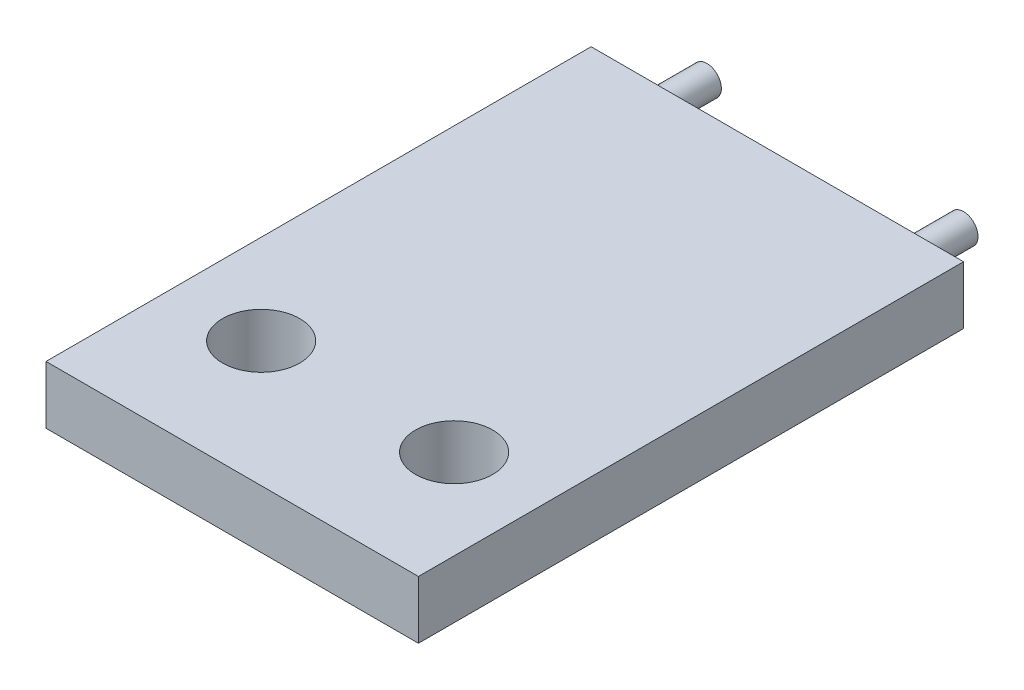
ISO-10303-21;
HEADER;
FILE_DESCRIPTION(('STEP AP214'),'2;1');
FILE_NAME('part.step','',(''),(''),'','','');
FILE_SCHEMA(('AUTOMOTIVE_DESIGN { 1 0 10303 214 1 1 1 1 }'));
ENDSEC;
DATA;
#1=APPLICATION_CONTEXT('core data for automotive mechanical design processes');
#2=APPLICATION_PROTOCOL_DEFINITION('international standard','automotive_design',2000,#1);
#3=PRODUCT_CONTEXT('',#1,'mechanical');
#4=PRODUCT('Part','Part','',(#3));
#5=PRODUCT_RELATED_PRODUCT_CATEGORY('part','',(#4));
#6=PRODUCT_DEFINITION_FORMATION('','',#4);
#7=PRODUCT_DEFINITION_CONTEXT('part definition',#1,'design');
#8=PRODUCT_DEFINITION('design','',#6,#7);
#9=PRODUCT_DEFINITION_SHAPE('','',#8);
#10=(LENGTH_UNIT() NAMED_UNIT(*) SI_UNIT(.MILLI.,.METRE.));
#11=(NAMED_UNIT(*) PLANE_ANGLE_UNIT() SI_UNIT($,.RADIAN.));
#12=(NAMED_UNIT(*) SI_UNIT($,.STERADIAN.) SOLID_ANGLE_UNIT());
#13=UNCERTAINTY_MEASURE_WITH_UNIT(LENGTH_MEASURE(1.E-05),#10,'distance_accuracy_value','');
#14=(GEOMETRIC_REPRESENTATION_CONTEXT(3) GLOBAL_UNCERTAINTY_ASSIGNED_CONTEXT((#13)) GLOBAL_UNIT_ASSIGNED_CONTEXT((#10,
#11,#12)) REPRESENTATION_CONTEXT('',''));
#15=CARTESIAN_POINT('',(0.,0.,0.));
#16=DIRECTION('',(0.,0.,1.));
#17=DIRECTION('',(1.,0.,0.));
#18=AXIS2_PLACEMENT_3D('',#15,#16,#17);
#19=CARTESIAN_POINT('',(0.,7.62,0.));
#20=DIRECTION('',(0.,1.,0.));
#21=DIRECTION('',(0.,0.,1.));
#22=AXIS2_PLACEMENT_3D('',#19,#20,#21);
#23=PLANE('',#22);
#24=DIRECTION('',(1.,0.,0.));
#25=VECTOR('',#24,1.);
#26=CARTESIAN_POINT('',(-24.511,7.62,-20.955));
#27=LINE('',#26,#25);
#28=CARTESIAN_POINT('',(-24.511,7.62,-20.955));
#29=VERTEX_POINT('',#28);
#30=CARTESIAN_POINT('',(24.511,7.62,-20.955));
#31=VERTEX_POINT('',#30);
#32=EDGE_CURVE('E47',#29,#31,#27,.T.);
#33=ORIENTED_EDGE('',*,*,#32,.F.);
#34=DIRECTION('',(0.,0.,1.));
#35=VECTOR('',#34,1.);
#36=CARTESIAN_POINT('',(-24.511,7.62,50.8));
#37=LINE('',#36,#35);
#38=CARTESIAN_POINT('',(-24.511,7.62,50.8));
#39=VERTEX_POINT('',#38);
#40=EDGE_CURVE('E88',#29,#39,#37,.T.);
#41=ORIENTED_EDGE('',*,*,#40,.T.);
#42=DIRECTION('',(1.,0.,0.));
#43=VECTOR('',#42,1.);
#44=CARTESIAN_POINT('',(24.511,7.62,50.8));
#45=LINE('',#44,#43);
#46=CARTESIAN_POINT('',(24.511,7.62,50.8));
#47=VERTEX_POINT('',#46);
#48=EDGE_CURVE('E56',#39,#47,#45,.T.);
#49=ORIENTED_EDGE('',*,*,#48,.T.);
#50=DIRECTION('',(0.,0.,-1.));
#51=VECTOR('',#50,1.);
#52=CARTESIAN_POINT('',(24.511,7.62,50.8));
#53=LINE('',#52,#51);
#54=EDGE_CURVE('E82',#47,#31,#53,.T.);
#55=ORIENTED_EDGE('',*,*,#54,.T.);
#56=EDGE_LOOP('',(#33,#41,#49,#55));
#57=FACE_BOUND('',#56,.T.);
#58=CARTESIAN_POINT('',(-12.7,7.62,34.29));
#59=DIRECTION('',(0.,1.,0.));
#60=DIRECTION('',(0.,0.,1.));
#61=AXIS2_PLACEMENT_3D('',#58,#59,#60);
#62=CIRCLE('',#61,5.08);
#63=CARTESIAN_POINT('',(-12.7,7.62,39.37));
#64=VERTEX_POINT('',#63);
#65=EDGE_CURVE('E99',#64,#64,#62,.T.);
#66=ORIENTED_EDGE('',*,*,#65,.F.);
#67=EDGE_LOOP('',(#66));
#68=FACE_BOUND('',#67,.T.);
#69=CARTESIAN_POINT('',(12.7,7.62,34.29));
#70=DIRECTION('',(0.,1.,0.));
#71=DIRECTION('',(0.,0.,1.));
#72=AXIS2_PLACEMENT_3D('',#69,#70,#71);
#73=CIRCLE('',#72,5.08);
#74=CARTESIAN_POINT('',(12.7,7.62,39.37));
#75=VERTEX_POINT('',#74);
#76=EDGE_CURVE('E103',#75,#75,#73,.F.);
#77=ORIENTED_EDGE('',*,*,#76,.T.);
#78=EDGE_LOOP('',(#77));
#79=FACE_BOUND('',#78,.T.);
#80=ADVANCED_FACE('F32',(#57,#68,#79),#23,.T.);
#81=CARTESIAN_POINT('',(0.,0.,0.));
#82=DIRECTION('',(0.,1.,0.));
#83=DIRECTION('',(0.,0.,1.));
#84=AXIS2_PLACEMENT_3D('',#81,#82,#83);
#85=PLANE('',#84);
#86=CARTESIAN_POINT('',(-12.7,0.,34.29));
#87=DIRECTION('',(0.,1.,0.));
#88=DIRECTION('',(0.,0.,1.));
#89=AXIS2_PLACEMENT_3D('',#86,#87,#88);
#90=CIRCLE('',#89,5.08);
#91=CARTESIAN_POINT('',(-12.7,0.,39.37));
#92=VERTEX_POINT('',#91);
#93=EDGE_CURVE('E96',#92,#92,#90,.T.);
#94=ORIENTED_EDGE('',*,*,#93,.T.);
#95=EDGE_LOOP('',(#94));
#96=FACE_BOUND('',#95,.T.);
#97=DIRECTION('',(0.,0.,1.));
#98=VECTOR('',#97,1.);
#99=CARTESIAN_POINT('',(-24.511,0.,50.8));
#100=LINE('',#99,#98);
#101=CARTESIAN_POINT('',(-24.511,0.,-20.955));
#102=VERTEX_POINT('',#101);
#103=CARTESIAN_POINT('',(-24.511,0.,50.8));
#104=VERTEX_POINT('',#103);
#105=EDGE_CURVE('E77',#102,#104,#100,.T.);
#106=ORIENTED_EDGE('',*,*,#105,.F.);
#107=DIRECTION('',(1.,0.,0.));
#108=VECTOR('',#107,1.);
#109=CARTESIAN_POINT('',(-24.511,0.,-20.955));
#110=LINE('',#109,#108);
#111=CARTESIAN_POINT('',(24.511,0.,-20.955));
#112=VERTEX_POINT('',#111);
#113=EDGE_CURVE('E87',#102,#112,#110,.T.);
#114=ORIENTED_EDGE('',*,*,#113,.T.);
#115=DIRECTION('',(0.,0.,-1.));
#116=VECTOR('',#115,1.);
#117=CARTESIAN_POINT('',(24.511,0.,50.8));
#118=LINE('',#117,#116);
#119=CARTESIAN_POINT('',(24.511,0.,50.8));
#120=VERTEX_POINT('',#119);
#121=EDGE_CURVE('E76',#120,#112,#118,.T.);
#122=ORIENTED_EDGE('',*,*,#121,.F.);
#123=DIRECTION('',(1.,0.,0.));
#124=VECTOR('',#123,1.);
#125=CARTESIAN_POINT('',(24.511,0.,50.8));
#126=LINE('',#125,#124);
#127=EDGE_CURVE('E68',#104,#120,#126,.T.);
#128=ORIENTED_EDGE('',*,*,#127,.F.);
#129=EDGE_LOOP('',(#106,#114,#122,#128));
#130=FACE_BOUND('',#129,.T.);
#131=CARTESIAN_POINT('',(12.7,0.,34.29));
#132=DIRECTION('',(0.,1.,0.));
#133=DIRECTION('',(0.,0.,1.));
#134=AXIS2_PLACEMENT_3D('',#131,#132,#133);
#135=CIRCLE('',#134,5.08);
#136=CARTESIAN_POINT('',(12.7,0.,39.37));
#137=VERTEX_POINT('',#136);
#138=EDGE_CURVE('E93',#137,#137,#135,.F.);
#139=ORIENTED_EDGE('',*,*,#138,.F.);
#140=EDGE_LOOP('',(#139));
#141=FACE_BOUND('',#140,.T.);
#142=ADVANCED_FACE('F84',(#96,#130,#141),#85,.F.);
#143=CARTESIAN_POINT('',(-24.511,7.62,50.8));
#144=DIRECTION('',(1.,0.,0.));
#145=DIRECTION('',(0.,0.,-1.));
#146=AXIS2_PLACEMENT_3D('',#143,#144,#145);
#147=PLANE('',#146);
#148=ORIENTED_EDGE('',*,*,#40,.F.);
#149=DIRECTION('',(0.,1.,0.));
#150=VECTOR('',#149,1.);
#151=CARTESIAN_POINT('',(-24.511,0.,-20.955));
#152=LINE('',#151,#150);
#153=EDGE_CURVE('E108',#102,#29,#152,.T.);
#154=ORIENTED_EDGE('',*,*,#153,.F.);
#155=ORIENTED_EDGE('',*,*,#105,.T.);
#156=DIRECTION('',(0.,-1.,0.));
#157=VECTOR('',#156,1.);
#158=CARTESIAN_POINT('',(-24.511,7.62,50.8));
#159=LINE('',#158,#157);
#160=EDGE_CURVE('E11',#39,#104,#159,.T.);
#161=ORIENTED_EDGE('',*,*,#160,.F.);
#162=EDGE_LOOP('',(#148,#154,#155,#161));
#163=FACE_BOUND('',#162,.T.);
#164=ADVANCED_FACE('F34',(#163),#147,.F.);
#165=CARTESIAN_POINT('',(24.511,7.62,50.8));
#166=DIRECTION('',(0.,0.,-1.));
#167=DIRECTION('',(-1.,0.,0.));
#168=AXIS2_PLACEMENT_3D('',#165,#166,#167);
#169=PLANE('',#168);
#170=ORIENTED_EDGE('',*,*,#127,.T.);
#171=DIRECTION('',(0.,-1.,0.));
#172=VECTOR('',#171,1.);
#173=CARTESIAN_POINT('',(24.511,7.62,50.8));
#174=LINE('',#173,#172);
#175=EDGE_CURVE('E40',#47,#120,#174,.T.);
#176=ORIENTED_EDGE('',*,*,#175,.F.);
#177=ORIENTED_EDGE('',*,*,#48,.F.);
#178=ORIENTED_EDGE('',*,*,#160,.T.);
#179=EDGE_LOOP('',(#170,#176,#177,#178));
#180=FACE_BOUND('',#179,.T.);
#181=ADVANCED_FACE('F70',(#180),#169,.F.);
#182=CARTESIAN_POINT('',(24.511,7.62,50.8));
#183=DIRECTION('',(-1.,0.,0.));
#184=DIRECTION('',(0.,0.,1.));
#185=AXIS2_PLACEMENT_3D('',#182,#183,#184);
#186=PLANE('',#185);
#187=ORIENTED_EDGE('',*,*,#121,.T.);
#188=DIRECTION('',(0.,1.,0.));
#189=VECTOR('',#188,1.);
#190=CARTESIAN_POINT('',(24.511,0.,-20.955));
#191=LINE('',#190,#189);
#192=EDGE_CURVE('E100',#112,#31,#191,.T.);
#193=ORIENTED_EDGE('',*,*,#192,.T.);
#194=ORIENTED_EDGE('',*,*,#54,.F.);
#195=ORIENTED_EDGE('',*,*,#175,.T.);
#196=EDGE_LOOP('',(#187,#193,#194,#195));
#197=FACE_BOUND('',#196,.T.);
#198=ADVANCED_FACE('F81',(#197),#186,.F.);
#199=CARTESIAN_POINT('',(-12.7,0.,34.29));
#200=DIRECTION('',(0.,1.,0.));
#201=DIRECTION('',(0.,0.,1.));
#202=AXIS2_PLACEMENT_3D('',#199,#200,#201);
#203=CYLINDRICAL_SURFACE('',#202,5.08);
#204=CARTESIAN_POINT('',(-12.7,0.,39.37));
#205=CARTESIAN_POINT('',(-12.7,0.0793749999999998,39.37));
#206=CARTESIAN_POINT('',(-12.7,0.15875,39.37));
#207=CARTESIAN_POINT('',(-12.7,0.3175,39.37));
#208=CARTESIAN_POINT('',(-12.7,0.396875,39.37));
#209=CARTESIAN_POINT('',(-12.7,0.555625,39.37));
#210=CARTESIAN_POINT('',(-12.7,0.635,39.37));
#211=CARTESIAN_POINT('',(-12.7,0.79375,39.37));
#212=CARTESIAN_POINT('',(-12.7,0.873125,39.37));
#213=CARTESIAN_POINT('',(-12.7,1.031875,39.37));
#214=CARTESIAN_POINT('',(-12.7,1.11125,39.37));
#215=CARTESIAN_POINT('',(-12.7,1.27,39.37));
#216=CARTESIAN_POINT('',(-12.7,1.349375,39.37));
#217=CARTESIAN_POINT('',(-12.7,1.508125,39.37));
#218=CARTESIAN_POINT('',(-12.7,1.5875,39.37));
#219=CARTESIAN_POINT('',(-12.7,1.74625,39.37));
#220=CARTESIAN_POINT('',(-12.7,1.825625,39.37));
#221=CARTESIAN_POINT('',(-12.7,1.984375,39.37));
#222=CARTESIAN_POINT('',(-12.7,2.06375,39.37));
#223=CARTESIAN_POINT('',(-12.7,2.2225,39.37));
#224=CARTESIAN_POINT('',(-12.7,2.301875,39.37));
#225=CARTESIAN_POINT('',(-12.7,2.460625,39.37));
#226=CARTESIAN_POINT('',(-12.7,2.54,39.37));
#227=CARTESIAN_POINT('',(-12.7,2.69875,39.37));
#228=CARTESIAN_POINT('',(-12.7,2.778125,39.37));
#229=CARTESIAN_POINT('',(-12.7,2.936875,39.37));
#230=CARTESIAN_POINT('',(-12.7,3.01625,39.37));
#231=CARTESIAN_POINT('',(-12.7,3.175,39.37));
#232=CARTESIAN_POINT('',(-12.7,3.254375,39.37));
#233=CARTESIAN_POINT('',(-12.7,3.413125,39.37));
#234=CARTESIAN_POINT('',(-12.7,3.4925,39.37));
#235=CARTESIAN_POINT('',(-12.7,3.65125,39.37));
#236=CARTESIAN_POINT('',(-12.7,3.730625,39.37));
#237=CARTESIAN_POINT('',(-12.7,3.889375,39.37));
#238=CARTESIAN_POINT('',(-12.7,3.96875,39.37));
#239=CARTESIAN_POINT('',(-12.7,4.1275,39.37));
#240=CARTESIAN_POINT('',(-12.7,4.206875,39.37));
#241=CARTESIAN_POINT('',(-12.7,4.365625,39.37));
#242=CARTESIAN_POINT('',(-12.7,4.445,39.37));
#243=CARTESIAN_POINT('',(-12.7,4.60375,39.37));
#244=CARTESIAN_POINT('',(-12.7,4.683125,39.37));
#245=CARTESIAN_POINT('',(-12.7,4.841875,39.37));
#246=CARTESIAN_POINT('',(-12.7,4.92125,39.37));
#247=CARTESIAN_POINT('',(-12.7,5.08,39.37));
#248=CARTESIAN_POINT('',(-12.7,5.159375,39.37));
#249=CARTESIAN_POINT('',(-12.7,5.318125,39.37));
#250=CARTESIAN_POINT('',(-12.7,5.3975,39.37));
#251=CARTESIAN_POINT('',(-12.7,5.55625,39.37));
#252=CARTESIAN_POINT('',(-12.7,5.635625,39.37));
#253=CARTESIAN_POINT('',(-12.7,5.794375,39.37));
#254=CARTESIAN_POINT('',(-12.7,5.87375,39.37));
#255=CARTESIAN_POINT('',(-12.7,6.0325,39.37));
#256=CARTESIAN_POINT('',(-12.7,6.111875,39.37));
#257=CARTESIAN_POINT('',(-12.7,6.270625,39.37));
#258=CARTESIAN_POINT('',(-12.7,6.35,39.37));
#259=CARTESIAN_POINT('',(-12.7,6.50875,39.37));
#260=CARTESIAN_POINT('',(-12.7,6.588125,39.37));
#261=CARTESIAN_POINT('',(-12.7,6.746875,39.37));
#262=CARTESIAN_POINT('',(-12.7,6.82625,39.37));
#263=CARTESIAN_POINT('',(-12.7,6.985,39.37));
#264=CARTESIAN_POINT('',(-12.7,7.064375,39.37));
#265=CARTESIAN_POINT('',(-12.7,7.223125,39.37));
#266=CARTESIAN_POINT('',(-12.7,7.3025,39.37));
#267=CARTESIAN_POINT('',(-12.7,7.46125,39.37));
#268=CARTESIAN_POINT('',(-12.7,7.540625,39.37));
#269=CARTESIAN_POINT('',(-12.7,7.62,39.37));
#270=B_SPLINE_CURVE_WITH_KNOTS('',3,(#204,#205,#206,#207,#208,#209,#210,#211,#212,#213,#214,
#215,#216,#217,#218,#219,#220,#221,#222,#223,#224,#225,#226,#227,#228,#229,#230,#231,#232,#233,
#234,#235,#236,#237,#238,#239,#240,#241,#242,#243,#244,#245,#246,#247,#248,#249,#250,#251,#252,
#253,#254,#255,#256,#257,#258,#259,#260,#261,#262,#263,#264,#265,#266,#267,#268,#269),
.UNSPECIFIED.,.F.,.F.,(4,2,2,2,2,2,2,2,2,2,2,2,2,2,2,2,2,2,2,2,2,2,2,2,2,2,2,2,2,2,2,2,4),(0.,
0.238125,0.47625,0.714375,0.9525,1.190625,1.42875,1.666875,1.905,2.143125,2.38125,2.619375,
2.8575,3.095625,3.33375,3.571875,3.81,4.048125,4.28625,4.524375,4.7625,5.000625,5.23875,
5.476875,5.715,5.953125,6.19125,6.429375,6.6675,6.905625,7.14375,7.381875,7.62),.UNSPECIFIED.);
#271=EDGE_CURVE('BSEAM160',#92,#64,#270,.T.);
#272=ORIENTED_EDGE('',*,*,#93,.F.);
#273=ORIENTED_EDGE('',*,*,#65,.T.);
#274=ORIENTED_EDGE('',*,*,#271,.T.);
#275=ORIENTED_EDGE('',*,*,#271,.F.);
#276=EDGE_LOOP('',(#272,#274,#273,#275));
#277=FACE_BOUND('',#276,.T.);
#278=ADVANCED_FACE('F160',(#277),#203,.F.);
#279=CARTESIAN_POINT('',(12.7,0.,34.29));
#280=DIRECTION('',(0.,1.,0.));
#281=DIRECTION('',(0.,0.,1.));
#282=AXIS2_PLACEMENT_3D('',#279,#280,#281);
#283=CYLINDRICAL_SURFACE('',#282,5.08);
#284=CARTESIAN_POINT('',(12.7,0.,39.37));
#285=CARTESIAN_POINT('',(12.7,0.0793749999999998,39.37));
#286=CARTESIAN_POINT('',(12.7,0.15875,39.37));
#287=CARTESIAN_POINT('',(12.7,0.3175,39.37));
#288=CARTESIAN_POINT('',(12.7,0.396875,39.37));
#289=CARTESIAN_POINT('',(12.7,0.555625,39.37));
#290=CARTESIAN_POINT('',(12.7,0.635,39.37));
#291=CARTESIAN_POINT('',(12.7,0.79375,39.37));
#292=CARTESIAN_POINT('',(12.7,0.873125,39.37));
#293=CARTESIAN_POINT('',(12.7,1.031875,39.37));
#294=CARTESIAN_POINT('',(12.7,1.11125,39.37));
#295=CARTESIAN_POINT('',(12.7,1.27,39.37));
#296=CARTESIAN_POINT('',(12.7,1.349375,39.37));
#297=CARTESIAN_POINT('',(12.7,1.508125,39.37));
#298=CARTESIAN_POINT('',(12.7,1.5875,39.37));
#299=CARTESIAN_POINT('',(12.7,1.74625,39.37));
#300=CARTESIAN_POINT('',(12.7,1.825625,39.37));
#301=CARTESIAN_POINT('',(12.7,1.984375,39.37));
#302=CARTESIAN_POINT('',(12.7,2.06375,39.37));
#303=CARTESIAN_POINT('',(12.7,2.2225,39.37));
#304=CARTESIAN_POINT('',(12.7,2.301875,39.37));
#305=CARTESIAN_POINT('',(12.7,2.460625,39.37));
#306=CARTESIAN_POINT('',(12.7,2.54,39.37));
#307=CARTESIAN_POINT('',(12.7,2.69875,39.37));
#308=CARTESIAN_POINT('',(12.7,2.778125,39.37));
#309=CARTESIAN_POINT('',(12.7,2.936875,39.37));
#310=CARTESIAN_POINT('',(12.7,3.01625,39.37));
#311=CARTESIAN_POINT('',(12.7,3.175,39.37));
#312=CARTESIAN_POINT('',(12.7,3.254375,39.37));
#313=CARTESIAN_POINT('',(12.7,3.413125,39.37));
#314=CARTESIAN_POINT('',(12.7,3.4925,39.37));
#315=CARTESIAN_POINT('',(12.7,3.65125,39.37));
#316=CARTESIAN_POINT('',(12.7,3.730625,39.37));
#317=CARTESIAN_POINT('',(12.7,3.889375,39.37));
#318=CARTESIAN_POINT('',(12.7,3.96875,39.37));
#319=CARTESIAN_POINT('',(12.7,4.1275,39.37));
#320=CARTESIAN_POINT('',(12.7,4.206875,39.37));
#321=CARTESIAN_POINT('',(12.7,4.365625,39.37));
#322=CARTESIAN_POINT('',(12.7,4.445,39.37));
#323=CARTESIAN_POINT('',(12.7,4.60375,39.37));
#324=CARTESIAN_POINT('',(12.7,4.683125,39.37));
#325=CARTESIAN_POINT('',(12.7,4.841875,39.37));
#326=CARTESIAN_POINT('',(12.7,4.92125,39.37));
#327=CARTESIAN_POINT('',(12.7,5.08,39.37));
#328=CARTESIAN_POINT('',(12.7,5.159375,39.37));
#329=CARTESIAN_POINT('',(12.7,5.318125,39.37));
#330=CARTESIAN_POINT('',(12.7,5.3975,39.37));
#331=CARTESIAN_POINT('',(12.7,5.55625,39.37));
#332=CARTESIAN_POINT('',(12.7,5.635625,39.37));
#333=CARTESIAN_POINT('',(12.7,5.794375,39.37));
#334=CARTESIAN_POINT('',(12.7,5.87375,39.37));
#335=CARTESIAN_POINT('',(12.7,6.0325,39.37));
#336=CARTESIAN_POINT('',(12.7,6.111875,39.37));
#337=CARTESIAN_POINT('',(12.7,6.270625,39.37));
#338=CARTESIAN_POINT('',(12.7,6.35,39.37));
#339=CARTESIAN_POINT('',(12.7,6.50875,39.37));
#340=CARTESIAN_POINT('',(12.7,6.588125,39.37));
#341=CARTESIAN_POINT('',(12.7,6.746875,39.37));
#342=CARTESIAN_POINT('',(12.7,6.82625,39.37));
#343=CARTESIAN_POINT('',(12.7,6.985,39.37));
#344=CARTESIAN_POINT('',(12.7,7.064375,39.37));
#345=CARTESIAN_POINT('',(12.7,7.223125,39.37));
#346=CARTESIAN_POINT('',(12.7,7.3025,39.37));
#347=CARTESIAN_POINT('',(12.7,7.46125,39.37));
#348=CARTESIAN_POINT('',(12.7,7.540625,39.37));
#349=CARTESIAN_POINT('',(12.7,7.62,39.37));
#350=B_SPLINE_CURVE_WITH_KNOTS('',3,(#284,#285,#286,#287,#288,#289,#290,#291,#292,#293,#294,
#295,#296,#297,#298,#299,#300,#301,#302,#303,#304,#305,#306,#307,#308,#309,#310,#311,#312,#313,
#314,#315,#316,#317,#318,#319,#320,#321,#322,#323,#324,#325,#326,#327,#328,#329,#330,#331,#332,
#333,#334,#335,#336,#337,#338,#339,#340,#341,#342,#343,#344,#345,#346,#347,#348,#349),
.UNSPECIFIED.,.F.,.F.,(4,2,2,2,2,2,2,2,2,2,2,2,2,2,2,2,2,2,2,2,2,2,2,2,2,2,2,2,2,2,2,2,4),(0.,
0.238125,0.47625,0.714375,0.9525,1.190625,1.42875,1.666875,1.905,2.143125,2.38125,2.619375,
2.8575,3.095625,3.33375,3.571875,3.81,4.048125,4.28625,4.524375,4.7625,5.000625,5.23875,
5.476875,5.715,5.953125,6.19125,6.429375,6.6675,6.905625,7.14375,7.381875,7.62),.UNSPECIFIED.);
#351=EDGE_CURVE('BSEAM150',#137,#75,#350,.T.);
#352=ORIENTED_EDGE('',*,*,#138,.T.);
#353=ORIENTED_EDGE('',*,*,#76,.F.);
#354=ORIENTED_EDGE('',*,*,#351,.T.);
#355=ORIENTED_EDGE('',*,*,#351,.F.);
#356=EDGE_LOOP('',(#352,#354,#353,#355));
#357=FACE_BOUND('',#356,.T.);
#358=ADVANCED_FACE('F150',(#357),#283,.F.);
#359=CARTESIAN_POINT('',(-24.511,0.,-20.955));
#360=DIRECTION('',(0.,0.,1.));
#361=DIRECTION('',(1.,0.,0.));
#362=AXIS2_PLACEMENT_3D('',#359,#360,#361);
#363=PLANE('',#362);
#364=CARTESIAN_POINT('',(16.891,3.81,-20.955));
#365=DIRECTION('',(0.,0.,-1.));
#366=DIRECTION('',(-1.,0.,0.));
#367=AXIS2_PLACEMENT_3D('',#364,#365,#366);
#368=CIRCLE('',#367,1.905);
#369=CARTESIAN_POINT('',(14.986,3.81,-20.955));
#370=VERTEX_POINT('',#369);
#371=EDGE_CURVE('E112',#370,#370,#368,.T.);
#372=ORIENTED_EDGE('',*,*,#371,.F.);
#373=EDGE_LOOP('',(#372));
#374=FACE_BOUND('',#373,.T.);
#375=CARTESIAN_POINT('',(7.62,3.81,-20.955));
#376=DIRECTION('',(0.,0.,-1.));
#377=DIRECTION('',(-1.,0.,0.));
#378=AXIS2_PLACEMENT_3D('',#375,#376,#377);
#379=CIRCLE('',#378,1.905);
#380=CARTESIAN_POINT('',(5.71500000000001,3.81,-20.955));
#381=VERTEX_POINT('',#380);
#382=EDGE_CURVE('E124',#381,#381,#379,.T.);
#383=ORIENTED_EDGE('',*,*,#382,.F.);
#384=EDGE_LOOP('',(#383));
#385=FACE_BOUND('',#384,.T.);
#386=CARTESIAN_POINT('',(-7.62,3.81,-20.955));
#387=DIRECTION('',(0.,0.,-1.));
#388=DIRECTION('',(-1.,0.,0.));
#389=AXIS2_PLACEMENT_3D('',#386,#387,#388);
#390=CIRCLE('',#389,1.905);
#391=CARTESIAN_POINT('',(-9.525,3.81,-20.955));
#392=VERTEX_POINT('',#391);
#393=EDGE_CURVE('E117',#392,#392,#390,.T.);
#394=ORIENTED_EDGE('',*,*,#393,.F.);
#395=EDGE_LOOP('',(#394));
#396=FACE_BOUND('',#395,.T.);
#397=CARTESIAN_POINT('',(-16.891,3.81,-20.955));
#398=DIRECTION('',(0.,0.,-1.));
#399=DIRECTION('',(-1.,0.,0.));
#400=AXIS2_PLACEMENT_3D('',#397,#398,#399);
#401=CIRCLE('',#400,1.905);
#402=CARTESIAN_POINT('',(-18.796,3.81,-20.955));
#403=VERTEX_POINT('',#402);
#404=EDGE_CURVE('E114',#403,#403,#401,.T.);
#405=ORIENTED_EDGE('',*,*,#404,.F.);
#406=EDGE_LOOP('',(#405));
#407=FACE_BOUND('',#406,.T.);
#408=ORIENTED_EDGE('',*,*,#32,.T.);
#409=ORIENTED_EDGE('',*,*,#192,.F.);
#410=ORIENTED_EDGE('',*,*,#113,.F.);
#411=ORIENTED_EDGE('',*,*,#153,.T.);
#412=EDGE_LOOP('',(#408,#409,#410,#411));
#413=FACE_BOUND('',#412,.T.);
#414=ADVANCED_FACE('F147',(#374,#385,#396,#407,#413),#363,.F.);
#415=CARTESIAN_POINT('',(-7.62,3.81,-3.175));
#416=DIRECTION('',(0.,0.,-1.));
#417=DIRECTION('',(-1.,0.,0.));
#418=AXIS2_PLACEMENT_3D('',#415,#416,#417);
#419=CYLINDRICAL_SURFACE('',#418,1.905);
#420=CARTESIAN_POINT('',(-7.62,3.81,-3.175));
#421=DIRECTION('',(0.,0.,-1.));
#422=DIRECTION('',(-1.,0.,0.));
#423=AXIS2_PLACEMENT_3D('',#420,#421,#422);
#424=CIRCLE('',#423,1.905);
#425=CARTESIAN_POINT('',(-9.525,3.81,-3.175));
#426=VERTEX_POINT('',#425);
#427=EDGE_CURVE('E121',#426,#426,#424,.T.);
#428=ORIENTED_EDGE('',*,*,#427,.F.);
#429=EDGE_LOOP('',(#428));
#430=FACE_BOUND('',#429,.T.);
#431=ORIENTED_EDGE('',*,*,#393,.T.);
#432=EDGE_LOOP('',(#431));
#433=FACE_BOUND('',#432,.T.);
#434=ADVANCED_FACE('F149',(#430,#433),#419,.F.);
#435=CARTESIAN_POINT('',(-7.62,3.81,-3.175));
#436=DIRECTION('',(0.,0.,-1.));
#437=DIRECTION('',(-1.,0.,0.));
#438=AXIS2_PLACEMENT_3D('',#435,#436,#437);
#439=PLANE('',#438);
#440=ORIENTED_EDGE('',*,*,#427,.T.);
#441=EDGE_LOOP('',(#440));
#442=FACE_BOUND('',#441,.T.);
#443=ADVANCED_FACE('F157',(#442),#439,.T.);
#444=CARTESIAN_POINT('',(7.62,3.81,-3.175));
#445=DIRECTION('',(0.,0.,-1.));
#446=DIRECTION('',(-1.,0.,0.));
#447=AXIS2_PLACEMENT_3D('',#444,#445,#446);
#448=CYLINDRICAL_SURFACE('',#447,1.905);
#449=CARTESIAN_POINT('',(7.62,3.81,-3.175));
#450=DIRECTION('',(0.,0.,-1.));
#451=DIRECTION('',(-1.,0.,0.));
#452=AXIS2_PLACEMENT_3D('',#449,#450,#451);
#453=CIRCLE('',#452,1.905);
#454=CARTESIAN_POINT('',(5.71500000000001,3.81,-3.175));
#455=VERTEX_POINT('',#454);
#456=EDGE_CURVE('E127',#455,#455,#453,.T.);
#457=ORIENTED_EDGE('',*,*,#456,.F.);
#458=EDGE_LOOP('',(#457));
#459=FACE_BOUND('',#458,.T.);
#460=ORIENTED_EDGE('',*,*,#382,.T.);
#461=EDGE_LOOP('',(#460));
#462=FACE_BOUND('',#461,.T.);
#463=ADVANCED_FACE('F242',(#459,#462),#448,.F.);
#464=CARTESIAN_POINT('',(7.62,3.81,-3.175));
#465=DIRECTION('',(0.,0.,-1.));
#466=DIRECTION('',(-1.,0.,0.));
#467=AXIS2_PLACEMENT_3D('',#464,#465,#466);
#468=PLANE('',#467);
#469=ORIENTED_EDGE('',*,*,#456,.T.);
#470=EDGE_LOOP('',(#469));
#471=FACE_BOUND('',#470,.T.);
#472=ADVANCED_FACE('F252',(#471),#468,.T.);
#473=CARTESIAN_POINT('',(16.891,3.81,-28.575));
#474=DIRECTION('',(0.,0.,1.));
#475=DIRECTION('',(1.,0.,0.));
#476=AXIS2_PLACEMENT_3D('',#473,#474,#475);
#477=CYLINDRICAL_SURFACE('',#476,1.905);
#478=CARTESIAN_POINT('',(16.891,3.81,-28.575));
#479=DIRECTION('',(0.,0.,-1.));
#480=DIRECTION('',(-1.,0.,0.));
#481=AXIS2_PLACEMENT_3D('',#478,#479,#480);
#482=CIRCLE('',#481,1.905);
#483=CARTESIAN_POINT('',(14.986,3.81,-28.575));
#484=VERTEX_POINT('',#483);
#485=EDGE_CURVE('E118',#484,#484,#482,.T.);
#486=ORIENTED_EDGE('',*,*,#485,.F.);
#487=EDGE_LOOP('',(#486));
#488=FACE_BOUND('',#487,.T.);
#489=ORIENTED_EDGE('',*,*,#371,.T.);
#490=EDGE_LOOP('',(#489));
#491=FACE_BOUND('',#490,.T.);
#492=ADVANCED_FACE('F262',(#488,#491),#477,.T.);
#493=CARTESIAN_POINT('',(16.891,3.81,-28.575));
#494=DIRECTION('',(0.,0.,-1.));
#495=DIRECTION('',(-1.,0.,0.));
#496=AXIS2_PLACEMENT_3D('',#493,#494,#495);
#497=PLANE('',#496);
#498=ORIENTED_EDGE('',*,*,#485,.T.);
#499=EDGE_LOOP('',(#498));
#500=FACE_BOUND('',#499,.T.);
#501=ADVANCED_FACE('F143',(#500),#497,.T.);
#502=CARTESIAN_POINT('',(-16.891,3.81,-28.575));
#503=DIRECTION('',(0.,0.,1.));
#504=DIRECTION('',(1.,0.,0.));
#505=AXIS2_PLACEMENT_3D('',#502,#503,#504);
#506=CYLINDRICAL_SURFACE('',#505,1.905);
#507=CARTESIAN_POINT('',(-16.891,3.81,-28.575));
#508=DIRECTION('',(0.,0.,-1.));
#509=DIRECTION('',(-1.,0.,0.));
#510=AXIS2_PLACEMENT_3D('',#507,#508,#509);
#511=CIRCLE('',#510,1.905);
#512=CARTESIAN_POINT('',(-18.796,3.81,-28.575));
#513=VERTEX_POINT('',#512);
#514=EDGE_CURVE('E134',#513,#513,#511,.T.);
#515=ORIENTED_EDGE('',*,*,#514,.F.);
#516=EDGE_LOOP('',(#515));
#517=FACE_BOUND('',#516,.T.);
#518=ORIENTED_EDGE('',*,*,#404,.T.);
#519=EDGE_LOOP('',(#518));
#520=FACE_BOUND('',#519,.T.);
#521=ADVANCED_FACE('F140',(#517,#520),#506,.T.);
#522=CARTESIAN_POINT('',(-16.891,3.81,-28.575));
#523=DIRECTION('',(0.,0.,-1.));
#524=DIRECTION('',(-1.,0.,0.));
#525=AXIS2_PLACEMENT_3D('',#522,#523,#524);
#526=PLANE('',#525);
#527=ORIENTED_EDGE('',*,*,#514,.T.);
#528=EDGE_LOOP('',(#527));
#529=FACE_BOUND('',#528,.T.);
#530=ADVANCED_FACE('F138',(#529),#526,.T.);
#531=CLOSED_SHELL('',(#80,#142,#164,#181,#198,#278,#358,#414,#434,#443,#463,#472,#492,#501,#521,#530));
#532=MANIFOLD_SOLID_BREP('B2',#531);
#533=ADVANCED_BREP_SHAPE_REPRESENTATION('',(#18,#532),#14);
#534=SHAPE_DEFINITION_REPRESENTATION(#9,#533);
ENDSEC;
END-ISO-10303-21;
